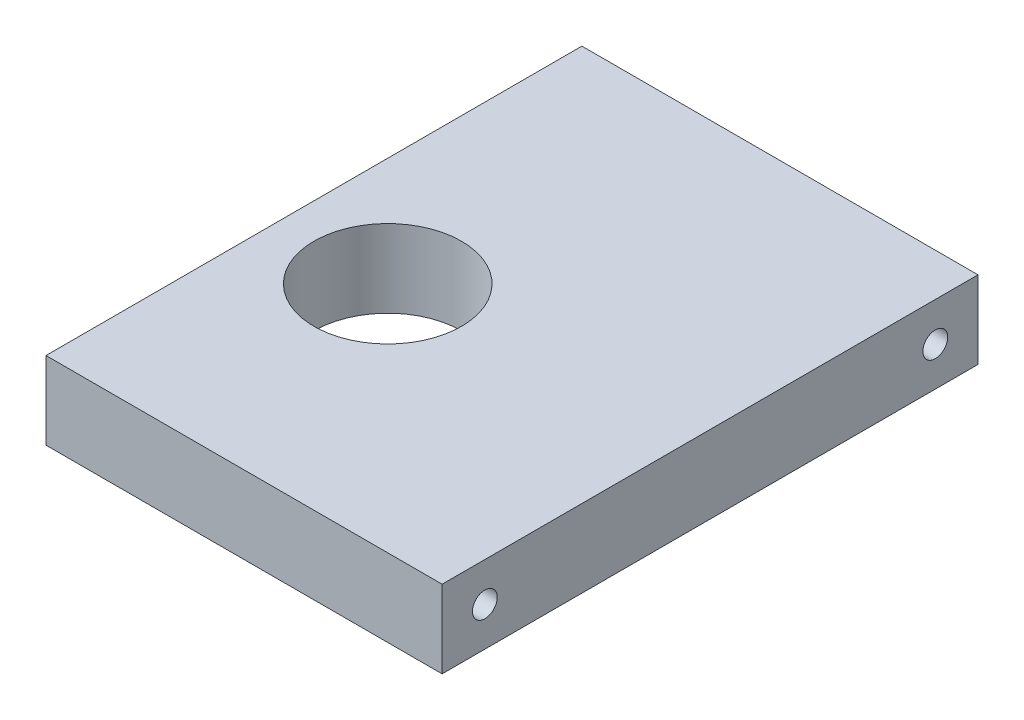
ISO-10303-21;
HEADER;
FILE_DESCRIPTION(('STEP AP214'),'2;1');
FILE_NAME('part.step','',(''),(''),'','','');
FILE_SCHEMA(('AUTOMOTIVE_DESIGN { 1 0 10303 214 1 1 1 1 }'));
ENDSEC;
DATA;
#1=APPLICATION_CONTEXT('core data for automotive mechanical design processes');
#2=APPLICATION_PROTOCOL_DEFINITION('international standard','automotive_design',2000,#1);
#3=PRODUCT_CONTEXT('',#1,'mechanical');
#4=PRODUCT('Part','Part','',(#3));
#5=PRODUCT_RELATED_PRODUCT_CATEGORY('part','',(#4));
#6=PRODUCT_DEFINITION_FORMATION('','',#4);
#7=PRODUCT_DEFINITION_CONTEXT('part definition',#1,'design');
#8=PRODUCT_DEFINITION('design','',#6,#7);
#9=PRODUCT_DEFINITION_SHAPE('','',#8);
#10=(LENGTH_UNIT() NAMED_UNIT(*) SI_UNIT(.MILLI.,.METRE.));
#11=(NAMED_UNIT(*) PLANE_ANGLE_UNIT() SI_UNIT($,.RADIAN.));
#12=(NAMED_UNIT(*) SI_UNIT($,.STERADIAN.) SOLID_ANGLE_UNIT());
#13=UNCERTAINTY_MEASURE_WITH_UNIT(LENGTH_MEASURE(1.E-05),#10,'distance_accuracy_value','');
#14=(GEOMETRIC_REPRESENTATION_CONTEXT(3) GLOBAL_UNCERTAINTY_ASSIGNED_CONTEXT((#13)) GLOBAL_UNIT_ASSIGNED_CONTEXT((#10,
#11,#12)) REPRESENTATION_CONTEXT('',''));
#15=CARTESIAN_POINT('',(0.,0.,0.));
#16=DIRECTION('',(0.,0.,1.));
#17=DIRECTION('',(1.,0.,0.));
#18=AXIS2_PLACEMENT_3D('',#15,#16,#17);
#19=CARTESIAN_POINT('',(12.75,5.,-17.25));
#20=DIRECTION('',(-1.,0.,0.));
#21=DIRECTION('',(0.,0.,1.));
#22=AXIS2_PLACEMENT_3D('',#19,#20,#21);
#23=PLANE('',#22);
#24=CARTESIAN_POINT('',(12.75,2.5,-14.5));
#25=DIRECTION('',(1.,0.,0.));
#26=DIRECTION('',(0.,0.,-1.));
#27=AXIS2_PLACEMENT_3D('',#24,#25,#26);
#28=CIRCLE('',#27,0.79999999999999);
#29=CARTESIAN_POINT('',(12.75,2.5,-15.3));
#30=VERTEX_POINT('',#29);
#31=EDGE_CURVE('E133',#30,#30,#28,.T.);
#32=ORIENTED_EDGE('',*,*,#31,.F.);
#33=EDGE_LOOP('',(#32));
#34=FACE_BOUND('',#33,.T.);
#35=CARTESIAN_POINT('',(12.75,2.5,14.5));
#36=DIRECTION('',(1.,0.,0.));
#37=DIRECTION('',(0.,0.,-1.));
#38=AXIS2_PLACEMENT_3D('',#35,#36,#37);
#39=CIRCLE('',#38,0.79999999999999);
#40=CARTESIAN_POINT('',(12.75,2.5,13.7));
#41=VERTEX_POINT('',#40);
#42=EDGE_CURVE('E139',#41,#41,#39,.T.);
#43=ORIENTED_EDGE('',*,*,#42,.F.);
#44=EDGE_LOOP('',(#43));
#45=FACE_BOUND('',#44,.T.);
#46=DIRECTION('',(0.,0.,-1.));
#47=VECTOR('',#46,1.);
#48=CARTESIAN_POINT('',(12.75,0.,-17.25));
#49=LINE('',#48,#47);
#50=CARTESIAN_POINT('',(12.75,0.,17.25));
#51=VERTEX_POINT('',#50);
#52=CARTESIAN_POINT('',(12.75,0.,-17.25));
#53=VERTEX_POINT('',#52);
#54=EDGE_CURVE('E145',#51,#53,#49,.T.);
#55=ORIENTED_EDGE('',*,*,#54,.T.);
#56=DIRECTION('',(0.,-1.,0.));
#57=VECTOR('',#56,1.);
#58=CARTESIAN_POINT('',(12.75,5.,-17.25));
#59=LINE('',#58,#57);
#60=CARTESIAN_POINT('',(12.75,5.,-17.25));
#61=VERTEX_POINT('',#60);
#62=EDGE_CURVE('E13',#61,#53,#59,.T.);
#63=ORIENTED_EDGE('',*,*,#62,.F.);
#64=DIRECTION('',(0.,0.,-1.));
#65=VECTOR('',#64,1.);
#66=CARTESIAN_POINT('',(12.75,5.,-17.25));
#67=LINE('',#66,#65);
#68=CARTESIAN_POINT('',(12.75,5.,17.25));
#69=VERTEX_POINT('',#68);
#70=EDGE_CURVE('E146',#69,#61,#67,.T.);
#71=ORIENTED_EDGE('',*,*,#70,.F.);
#72=DIRECTION('',(0.,-1.,0.));
#73=VECTOR('',#72,1.);
#74=CARTESIAN_POINT('',(12.75,5.,17.25));
#75=LINE('',#74,#73);
#76=EDGE_CURVE('E152',#69,#51,#75,.T.);
#77=ORIENTED_EDGE('',*,*,#76,.T.);
#78=EDGE_LOOP('',(#55,#63,#71,#77));
#79=FACE_BOUND('',#78,.T.);
#80=ADVANCED_FACE('F50',(#34,#45,#79),#23,.F.);
#81=CARTESIAN_POINT('',(-12.75,5.,-17.25));
#82=DIRECTION('',(0.,0.,1.));
#83=DIRECTION('',(1.,0.,0.));
#84=AXIS2_PLACEMENT_3D('',#81,#82,#83);
#85=PLANE('',#84);
#86=DIRECTION('',(-1.,0.,0.));
#87=VECTOR('',#86,1.);
#88=CARTESIAN_POINT('',(-12.75,0.,-17.25));
#89=LINE('',#88,#87);
#90=CARTESIAN_POINT('',(-12.75,0.,-17.25));
#91=VERTEX_POINT('',#90);
#92=EDGE_CURVE('E155',#53,#91,#89,.T.);
#93=ORIENTED_EDGE('',*,*,#92,.T.);
#94=DIRECTION('',(0.,-1.,0.));
#95=VECTOR('',#94,1.);
#96=CARTESIAN_POINT('',(-12.75,5.,-17.25));
#97=LINE('',#96,#95);
#98=CARTESIAN_POINT('',(-12.75,5.,-17.25));
#99=VERTEX_POINT('',#98);
#100=EDGE_CURVE('E58',#99,#91,#97,.T.);
#101=ORIENTED_EDGE('',*,*,#100,.F.);
#102=DIRECTION('',(-1.,0.,0.));
#103=VECTOR('',#102,1.);
#104=CARTESIAN_POINT('',(-12.75,5.,-17.25));
#105=LINE('',#104,#103);
#106=EDGE_CURVE('E97',#61,#99,#105,.T.);
#107=ORIENTED_EDGE('',*,*,#106,.F.);
#108=ORIENTED_EDGE('',*,*,#62,.T.);
#109=EDGE_LOOP('',(#93,#101,#107,#108));
#110=FACE_BOUND('',#109,.T.);
#111=ADVANCED_FACE('F179',(#110),#85,.F.);
#112=CARTESIAN_POINT('',(-12.75,5.,-17.25));
#113=DIRECTION('',(1.,0.,0.));
#114=DIRECTION('',(0.,0.,-1.));
#115=AXIS2_PLACEMENT_3D('',#112,#113,#114);
#116=PLANE('',#115);
#117=CARTESIAN_POINT('',(-12.75,2.5,-14.5));
#118=DIRECTION('',(-1.,0.,0.));
#119=DIRECTION('',(0.,0.,1.));
#120=AXIS2_PLACEMENT_3D('',#117,#118,#119);
#121=CIRCLE('',#120,0.79999999999999);
#122=CARTESIAN_POINT('',(-12.75,2.5,-13.7));
#123=VERTEX_POINT('',#122);
#124=EDGE_CURVE('E121',#123,#123,#121,.T.);
#125=ORIENTED_EDGE('',*,*,#124,.F.);
#126=EDGE_LOOP('',(#125));
#127=FACE_BOUND('',#126,.T.);
#128=CARTESIAN_POINT('',(-12.75,2.5,14.5));
#129=DIRECTION('',(-1.,0.,0.));
#130=DIRECTION('',(0.,0.,1.));
#131=AXIS2_PLACEMENT_3D('',#128,#129,#130);
#132=CIRCLE('',#131,0.79999999999999);
#133=CARTESIAN_POINT('',(-12.75,2.5,15.3));
#134=VERTEX_POINT('',#133);
#135=EDGE_CURVE('E120',#134,#134,#132,.T.);
#136=ORIENTED_EDGE('',*,*,#135,.F.);
#137=EDGE_LOOP('',(#136));
#138=FACE_BOUND('',#137,.T.);
#139=DIRECTION('',(0.,0.,1.));
#140=VECTOR('',#139,1.);
#141=CARTESIAN_POINT('',(-12.75,0.,-17.25));
#142=LINE('',#141,#140);
#143=CARTESIAN_POINT('',(-12.75,0.,17.25));
#144=VERTEX_POINT('',#143);
#145=EDGE_CURVE('E84',#91,#144,#142,.T.);
#146=ORIENTED_EDGE('',*,*,#145,.T.);
#147=DIRECTION('',(0.,-1.,0.));
#148=VECTOR('',#147,1.);
#149=CARTESIAN_POINT('',(-12.75,5.,17.25));
#150=LINE('',#149,#148);
#151=CARTESIAN_POINT('',(-12.75,5.,17.25));
#152=VERTEX_POINT('',#151);
#153=EDGE_CURVE('E160',#152,#144,#150,.T.);
#154=ORIENTED_EDGE('',*,*,#153,.F.);
#155=DIRECTION('',(0.,0.,1.));
#156=VECTOR('',#155,1.);
#157=CARTESIAN_POINT('',(-12.75,5.,-17.25));
#158=LINE('',#157,#156);
#159=EDGE_CURVE('E149',#99,#152,#158,.T.);
#160=ORIENTED_EDGE('',*,*,#159,.F.);
#161=ORIENTED_EDGE('',*,*,#100,.T.);
#162=EDGE_LOOP('',(#146,#154,#160,#161));
#163=FACE_BOUND('',#162,.T.);
#164=ADVANCED_FACE('F162',(#127,#138,#163),#116,.F.);
#165=CARTESIAN_POINT('',(-12.75,5.,17.25));
#166=DIRECTION('',(0.,0.,-1.));
#167=DIRECTION('',(-1.,0.,0.));
#168=AXIS2_PLACEMENT_3D('',#165,#166,#167);
#169=PLANE('',#168);
#170=DIRECTION('',(1.,0.,0.));
#171=VECTOR('',#170,1.);
#172=CARTESIAN_POINT('',(-12.75,0.,17.25));
#173=LINE('',#172,#171);
#174=EDGE_CURVE('E90',#144,#51,#173,.T.);
#175=ORIENTED_EDGE('',*,*,#174,.T.);
#176=ORIENTED_EDGE('',*,*,#76,.F.);
#177=DIRECTION('',(1.,0.,0.));
#178=VECTOR('',#177,1.);
#179=CARTESIAN_POINT('',(-12.75,5.,17.25));
#180=LINE('',#179,#178);
#181=EDGE_CURVE('E66',#152,#69,#180,.T.);
#182=ORIENTED_EDGE('',*,*,#181,.F.);
#183=ORIENTED_EDGE('',*,*,#153,.T.);
#184=EDGE_LOOP('',(#175,#176,#182,#183));
#185=FACE_BOUND('',#184,.T.);
#186=ADVANCED_FACE('F169',(#185),#169,.F.);
#187=CARTESIAN_POINT('',(0.,5.,0.));
#188=DIRECTION('',(0.,1.,0.));
#189=DIRECTION('',(0.,0.,1.));
#190=AXIS2_PLACEMENT_3D('',#187,#188,#189);
#191=PLANE('',#190);
#192=CARTESIAN_POINT('',(-5.75,5.,2.25));
#193=DIRECTION('',(0.,-1.,0.));
#194=DIRECTION('',(0.,0.,-1.));
#195=AXIS2_PLACEMENT_3D('',#192,#193,#194);
#196=CIRCLE('',#195,4.75);
#197=CARTESIAN_POINT('',(-5.75,5.,-2.5));
#198=VERTEX_POINT('',#197);
#199=EDGE_CURVE('E127',#198,#198,#196,.T.);
#200=ORIENTED_EDGE('',*,*,#199,.T.);
#201=EDGE_LOOP('',(#200));
#202=FACE_BOUND('',#201,.T.);
#203=ORIENTED_EDGE('',*,*,#70,.T.);
#204=ORIENTED_EDGE('',*,*,#106,.T.);
#205=ORIENTED_EDGE('',*,*,#159,.T.);
#206=ORIENTED_EDGE('',*,*,#181,.T.);
#207=EDGE_LOOP('',(#203,#204,#205,#206));
#208=FACE_BOUND('',#207,.T.);
#209=ADVANCED_FACE('F171',(#202,#208),#191,.T.);
#210=CARTESIAN_POINT('',(0.,0.,0.));
#211=DIRECTION('',(0.,1.,0.));
#212=DIRECTION('',(0.,0.,1.));
#213=AXIS2_PLACEMENT_3D('',#210,#211,#212);
#214=PLANE('',#213);
#215=CARTESIAN_POINT('',(-5.75,0.,2.25));
#216=DIRECTION('',(0.,-1.,0.));
#217=DIRECTION('',(0.,0.,-1.));
#218=AXIS2_PLACEMENT_3D('',#215,#216,#217);
#219=CIRCLE('',#218,4.75);
#220=CARTESIAN_POINT('',(-5.75,0.,-2.5));
#221=VERTEX_POINT('',#220);
#222=EDGE_CURVE('E215',#221,#221,#219,.T.);
#223=ORIENTED_EDGE('',*,*,#222,.F.);
#224=EDGE_LOOP('',(#223));
#225=FACE_BOUND('',#224,.T.);
#226=ORIENTED_EDGE('',*,*,#54,.F.);
#227=ORIENTED_EDGE('',*,*,#174,.F.);
#228=ORIENTED_EDGE('',*,*,#145,.F.);
#229=ORIENTED_EDGE('',*,*,#92,.F.);
#230=EDGE_LOOP('',(#226,#227,#228,#229));
#231=FACE_BOUND('',#230,.T.);
#232=ADVANCED_FACE('F165',(#225,#231),#214,.F.);
#233=CARTESIAN_POINT('',(7.55,2.5,14.5));
#234=DIRECTION('',(1.,0.,0.));
#235=DIRECTION('',(0.,0.,-1.));
#236=AXIS2_PLACEMENT_3D('',#233,#234,#235);
#237=CONICAL_SURFACE('',#236,0.799999999999988,1.02974425867664);
#238=CARTESIAN_POINT('',(7.06931150477795,2.49999999999999,14.5));
#239=VERTEX_POINT('',#238);
#240=VERTEX_LOOP('',#239);
#241=FACE_BOUND('',#240,.T.);
#242=CARTESIAN_POINT('',(7.55,2.5,14.5));
#243=DIRECTION('',(1.,0.,0.));
#244=DIRECTION('',(0.,0.,-1.));
#245=AXIS2_PLACEMENT_3D('',#242,#243,#244);
#246=CIRCLE('',#245,0.799999999999988);
#247=CARTESIAN_POINT('',(7.55,2.5,13.7));
#248=VERTEX_POINT('',#247);
#249=EDGE_CURVE('E142',#248,#248,#246,.T.);
#250=ORIENTED_EDGE('',*,*,#249,.T.);
#251=EDGE_LOOP('',(#250));
#252=FACE_BOUND('',#251,.T.);
#253=ADVANCED_FACE('F195',(#241,#252),#237,.F.);
#254=CARTESIAN_POINT('',(12.75,2.5,14.5));
#255=DIRECTION('',(1.,0.,0.));
#256=DIRECTION('',(0.,0.,-1.));
#257=AXIS2_PLACEMENT_3D('',#254,#255,#256);
#258=CYLINDRICAL_SURFACE('',#257,0.799999999999989);
#259=ORIENTED_EDGE('',*,*,#249,.F.);
#260=EDGE_LOOP('',(#259));
#261=FACE_BOUND('',#260,.T.);
#262=ORIENTED_EDGE('',*,*,#42,.T.);
#263=EDGE_LOOP('',(#262));
#264=FACE_BOUND('',#263,.T.);
#265=ADVANCED_FACE('F192',(#261,#264),#258,.F.);
#266=CARTESIAN_POINT('',(7.55,2.5,-14.5));
#267=DIRECTION('',(1.,0.,0.));
#268=DIRECTION('',(0.,0.,-1.));
#269=AXIS2_PLACEMENT_3D('',#266,#267,#268);
#270=CONICAL_SURFACE('',#269,0.799999999999988,1.02974425867664);
#271=CARTESIAN_POINT('',(7.06931150477794,2.49999999999999,-14.5));
#272=VERTEX_POINT('',#271);
#273=VERTEX_LOOP('',#272);
#274=FACE_BOUND('',#273,.T.);
#275=CARTESIAN_POINT('',(7.55,2.5,-14.5));
#276=DIRECTION('',(1.,0.,0.));
#277=DIRECTION('',(0.,0.,-1.));
#278=AXIS2_PLACEMENT_3D('',#275,#276,#277);
#279=CIRCLE('',#278,0.799999999999988);
#280=CARTESIAN_POINT('',(7.55,2.5,-15.3));
#281=VERTEX_POINT('',#280);
#282=EDGE_CURVE('E136',#281,#281,#279,.T.);
#283=ORIENTED_EDGE('',*,*,#282,.T.);
#284=EDGE_LOOP('',(#283));
#285=FACE_BOUND('',#284,.T.);
#286=ADVANCED_FACE('F194',(#274,#285),#270,.F.);
#287=CARTESIAN_POINT('',(12.75,2.5,-14.5));
#288=DIRECTION('',(1.,0.,0.));
#289=DIRECTION('',(0.,0.,-1.));
#290=AXIS2_PLACEMENT_3D('',#287,#288,#289);
#291=CYLINDRICAL_SURFACE('',#290,0.799999999999989);
#292=ORIENTED_EDGE('',*,*,#282,.F.);
#293=EDGE_LOOP('',(#292));
#294=FACE_BOUND('',#293,.T.);
#295=ORIENTED_EDGE('',*,*,#31,.T.);
#296=EDGE_LOOP('',(#295));
#297=FACE_BOUND('',#296,.T.);
#298=ADVANCED_FACE('F202',(#294,#297),#291,.F.);
#299=CARTESIAN_POINT('',(-7.55,2.5,14.5));
#300=DIRECTION('',(-1.,0.,0.));
#301=DIRECTION('',(0.,0.,1.));
#302=AXIS2_PLACEMENT_3D('',#299,#300,#301);
#303=CONICAL_SURFACE('',#302,0.799999999999988,1.02974425867664);
#304=CARTESIAN_POINT('',(-7.06931150477795,2.49999999999999,14.5));
#305=VERTEX_POINT('',#304);
#306=VERTEX_LOOP('',#305);
#307=FACE_BOUND('',#306,.T.);
#308=CARTESIAN_POINT('',(-7.55,2.5,14.5));
#309=DIRECTION('',(-1.,0.,0.));
#310=DIRECTION('',(0.,0.,1.));
#311=AXIS2_PLACEMENT_3D('',#308,#309,#310);
#312=CIRCLE('',#311,0.799999999999988);
#313=CARTESIAN_POINT('',(-7.55,2.5,15.3));
#314=VERTEX_POINT('',#313);
#315=EDGE_CURVE('E124',#314,#314,#312,.T.);
#316=ORIENTED_EDGE('',*,*,#315,.T.);
#317=EDGE_LOOP('',(#316));
#318=FACE_BOUND('',#317,.T.);
#319=ADVANCED_FACE('F231',(#307,#318),#303,.F.);
#320=CARTESIAN_POINT('',(-12.75,2.5,14.5));
#321=DIRECTION('',(-1.,0.,0.));
#322=DIRECTION('',(0.,0.,1.));
#323=AXIS2_PLACEMENT_3D('',#320,#321,#322);
#324=CYLINDRICAL_SURFACE('',#323,0.799999999999989);
#325=ORIENTED_EDGE('',*,*,#315,.F.);
#326=EDGE_LOOP('',(#325));
#327=FACE_BOUND('',#326,.T.);
#328=ORIENTED_EDGE('',*,*,#135,.T.);
#329=EDGE_LOOP('',(#328));
#330=FACE_BOUND('',#329,.T.);
#331=ADVANCED_FACE('F114',(#327,#330),#324,.F.);
#332=CARTESIAN_POINT('',(-7.55,2.5,-14.5));
#333=DIRECTION('',(-1.,0.,0.));
#334=DIRECTION('',(0.,0.,1.));
#335=AXIS2_PLACEMENT_3D('',#332,#333,#334);
#336=CONICAL_SURFACE('',#335,0.799999999999988,1.02974425867664);
#337=CARTESIAN_POINT('',(-7.06931150477794,2.49999999999999,-14.5));
#338=VERTEX_POINT('',#337);
#339=VERTEX_LOOP('',#338);
#340=FACE_BOUND('',#339,.T.);
#341=CARTESIAN_POINT('',(-7.55,2.5,-14.5));
#342=DIRECTION('',(-1.,0.,0.));
#343=DIRECTION('',(0.,0.,1.));
#344=AXIS2_PLACEMENT_3D('',#341,#342,#343);
#345=CIRCLE('',#344,0.799999999999988);
#346=CARTESIAN_POINT('',(-7.55,2.5,-13.7));
#347=VERTEX_POINT('',#346);
#348=EDGE_CURVE('E118',#347,#347,#345,.T.);
#349=ORIENTED_EDGE('',*,*,#348,.T.);
#350=EDGE_LOOP('',(#349));
#351=FACE_BOUND('',#350,.T.);
#352=ADVANCED_FACE('F110',(#340,#351),#336,.F.);
#353=CARTESIAN_POINT('',(-12.75,2.5,-14.5));
#354=DIRECTION('',(-1.,0.,0.));
#355=DIRECTION('',(0.,0.,1.));
#356=AXIS2_PLACEMENT_3D('',#353,#354,#355);
#357=CYLINDRICAL_SURFACE('',#356,0.799999999999989);
#358=ORIENTED_EDGE('',*,*,#348,.F.);
#359=EDGE_LOOP('',(#358));
#360=FACE_BOUND('',#359,.T.);
#361=ORIENTED_EDGE('',*,*,#124,.T.);
#362=EDGE_LOOP('',(#361));
#363=FACE_BOUND('',#362,.T.);
#364=ADVANCED_FACE('F113',(#360,#363),#357,.F.);
#365=CARTESIAN_POINT('',(-5.75,5.,2.25));
#366=DIRECTION('',(0.,-1.,0.));
#367=DIRECTION('',(0.,0.,-1.));
#368=AXIS2_PLACEMENT_3D('',#365,#366,#367);
#369=CYLINDRICAL_SURFACE('',#368,4.75);
#370=ORIENTED_EDGE('',*,*,#199,.F.);
#371=EDGE_LOOP('',(#370));
#372=FACE_BOUND('',#371,.T.);
#373=ORIENTED_EDGE('',*,*,#222,.T.);
#374=EDGE_LOOP('',(#373));
#375=FACE_BOUND('',#374,.T.);
#376=ADVANCED_FACE('F221',(#372,#375),#369,.F.);
#377=CLOSED_SHELL('',(#80,#111,#164,#186,#209,#232,#253,#265,#286,#298,#319,#331,#352,#364,#376));
#378=MANIFOLD_SOLID_BREP('B2',#377);
#379=ADVANCED_BREP_SHAPE_REPRESENTATION('',(#18,#378),#14);
#380=SHAPE_DEFINITION_REPRESENTATION(#9,#379);
ENDSEC;
END-ISO-10303-21;
